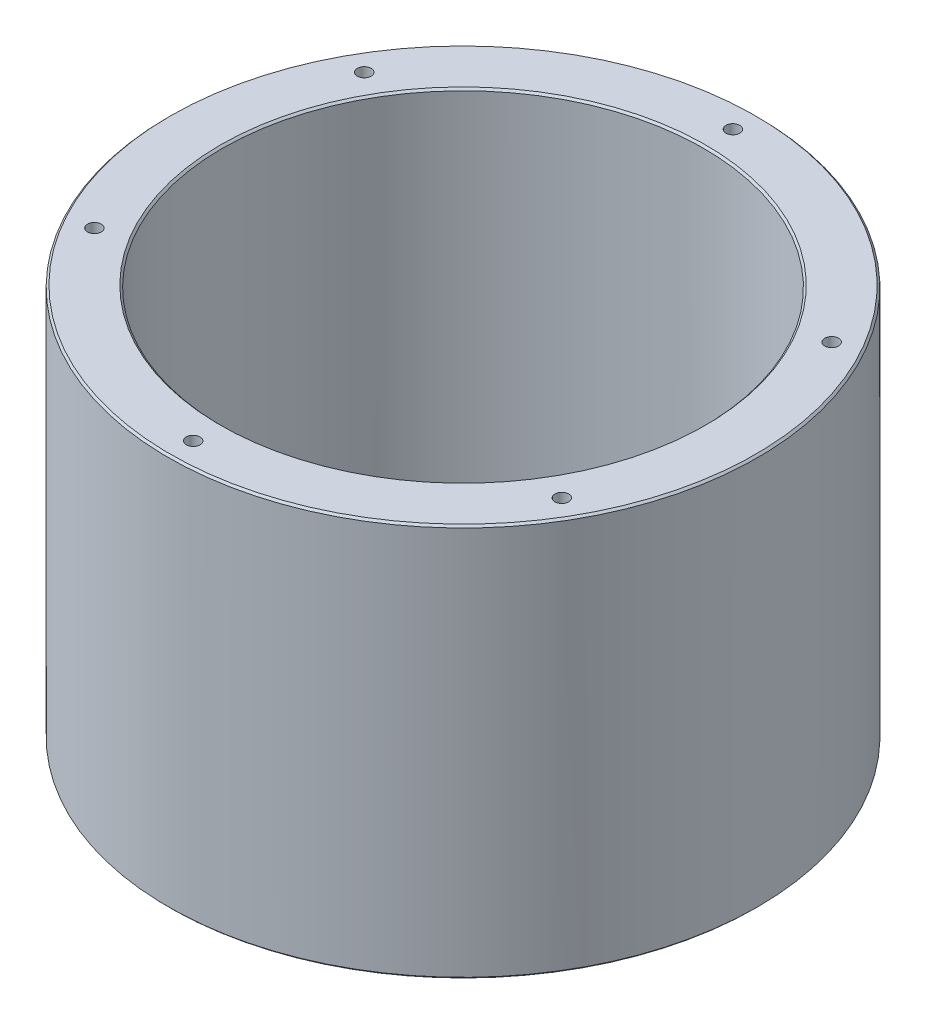
ISO-10303-21;
HEADER;
FILE_DESCRIPTION(('STEP AP214'),'2;1');
FILE_NAME('part.step','',(''),(''),'','','');
FILE_SCHEMA(('AUTOMOTIVE_DESIGN { 1 0 10303 214 1 1 1 1 }'));
ENDSEC;
DATA;
#1=APPLICATION_CONTEXT('core data for automotive mechanical design processes');
#2=APPLICATION_PROTOCOL_DEFINITION('international standard','automotive_design',2000,#1);
#3=PRODUCT_CONTEXT('',#1,'mechanical');
#4=PRODUCT('Part','Part','',(#3));
#5=PRODUCT_RELATED_PRODUCT_CATEGORY('part','',(#4));
#6=PRODUCT_DEFINITION_FORMATION('','',#4);
#7=PRODUCT_DEFINITION_CONTEXT('part definition',#1,'design');
#8=PRODUCT_DEFINITION('design','',#6,#7);
#9=PRODUCT_DEFINITION_SHAPE('','',#8);
#10=(LENGTH_UNIT() NAMED_UNIT(*) SI_UNIT(.MILLI.,.METRE.));
#11=(NAMED_UNIT(*) PLANE_ANGLE_UNIT() SI_UNIT($,.RADIAN.));
#12=(NAMED_UNIT(*) SI_UNIT($,.STERADIAN.) SOLID_ANGLE_UNIT());
#13=UNCERTAINTY_MEASURE_WITH_UNIT(LENGTH_MEASURE(1.E-05),#10,'distance_accuracy_value','');
#14=(GEOMETRIC_REPRESENTATION_CONTEXT(3) GLOBAL_UNCERTAINTY_ASSIGNED_CONTEXT((#13)) GLOBAL_UNIT_ASSIGNED_CONTEXT((#10,
#11,#12)) REPRESENTATION_CONTEXT('',''));
#15=CARTESIAN_POINT('',(0.,0.,0.));
#16=DIRECTION('',(0.,0.,1.));
#17=DIRECTION('',(1.,0.,0.));
#18=AXIS2_PLACEMENT_3D('',#15,#16,#17);
#19=CARTESIAN_POINT('',(0.,193.596256239601,0.));
#20=DIRECTION('',(0.,1.,0.));
#21=DIRECTION('',(-1.,0.,0.));
#22=AXIS2_PLACEMENT_3D('',#19,#20,#21);
#23=CYLINDRICAL_SURFACE('',#22,150.);
#24=CARTESIAN_POINT('',(0.,-25.4037437603992,0.));
#25=DIRECTION('',(0.,-1.,0.));
#26=DIRECTION('',(1.,0.,0.));
#27=AXIS2_PLACEMENT_3D('',#24,#25,#26);
#28=CIRCLE('',#27,150.);
#29=CARTESIAN_POINT('',(150.,-25.4037437603992,0.));
#30=VERTEX_POINT('',#29);
#31=EDGE_CURVE('E168',#30,#30,#28,.F.);
#32=ORIENTED_EDGE('',*,*,#31,.T.);
#33=EDGE_LOOP('',(#32));
#34=FACE_BOUND('',#33,.T.);
#35=CARTESIAN_POINT('',(0.,172.596256239601,0.));
#36=DIRECTION('',(0.,1.,0.));
#37=DIRECTION('',(-1.,0.,0.));
#38=AXIS2_PLACEMENT_3D('',#35,#36,#37);
#39=CIRCLE('',#38,150.);
#40=CARTESIAN_POINT('',(-150.,172.596256239601,0.));
#41=VERTEX_POINT('',#40);
#42=EDGE_CURVE('E165',#41,#41,#39,.F.);
#43=ORIENTED_EDGE('',*,*,#42,.T.);
#44=EDGE_LOOP('',(#43));
#45=FACE_BOUND('',#44,.T.);
#46=ADVANCED_FACE('F39',(#34,#45),#23,.T.);
#47=CARTESIAN_POINT('',(0.,-26.4037437603993,0.));
#48=DIRECTION('',(0.,-1.,0.));
#49=DIRECTION('',(1.,0.,0.));
#50=AXIS2_PLACEMENT_3D('',#47,#48,#49);
#51=PLANE('',#50);
#52=CARTESIAN_POINT('',(0.,-26.4037437603993,-137.316));
#53=DIRECTION('',(0.,-1.,0.));
#54=DIRECTION('',(0.,0.,-1.));
#55=AXIS2_PLACEMENT_3D('',#52,#53,#54);
#56=CIRCLE('',#55,3.49999999999999);
#57=CARTESIAN_POINT('',(0.,-26.4037437603993,-140.816));
#58=VERTEX_POINT('',#57);
#59=EDGE_CURVE('E95',#58,#58,#56,.T.);
#60=ORIENTED_EDGE('',*,*,#59,.F.);
#61=EDGE_LOOP('',(#60));
#62=FACE_BOUND('',#61,.T.);
#63=CARTESIAN_POINT('',(118.919144346064,-26.4037437603993,-68.6580000000001));
#64=DIRECTION('',(0.,-1.,0.));
#65=DIRECTION('',(0.,0.,-1.));
#66=AXIS2_PLACEMENT_3D('',#63,#64,#65);
#67=CIRCLE('',#66,3.49999999999999);
#68=CARTESIAN_POINT('',(118.919144346064,-26.4037437603993,-72.1580000000001));
#69=VERTEX_POINT('',#68);
#70=EDGE_CURVE('E94',#69,#69,#67,.T.);
#71=ORIENTED_EDGE('',*,*,#70,.F.);
#72=EDGE_LOOP('',(#71));
#73=FACE_BOUND('',#72,.T.);
#74=CARTESIAN_POINT('',(118.919144346064,-26.4037437603993,68.6580000000001));
#75=DIRECTION('',(0.,-1.,0.));
#76=DIRECTION('',(0.,0.,-1.));
#77=AXIS2_PLACEMENT_3D('',#74,#75,#76);
#78=CIRCLE('',#77,3.49999999999999);
#79=CARTESIAN_POINT('',(118.919144346064,-26.4037437603993,65.1580000000001));
#80=VERTEX_POINT('',#79);
#81=EDGE_CURVE('E105',#80,#80,#78,.T.);
#82=ORIENTED_EDGE('',*,*,#81,.F.);
#83=EDGE_LOOP('',(#82));
#84=FACE_BOUND('',#83,.T.);
#85=CARTESIAN_POINT('',(0.,-26.4037437603993,137.316));
#86=DIRECTION('',(0.,-1.,0.));
#87=DIRECTION('',(0.,0.,-1.));
#88=AXIS2_PLACEMENT_3D('',#85,#86,#87);
#89=CIRCLE('',#88,3.49999999999999);
#90=CARTESIAN_POINT('',(0.,-26.4037437603993,133.816));
#91=VERTEX_POINT('',#90);
#92=EDGE_CURVE('E111',#91,#91,#89,.T.);
#93=ORIENTED_EDGE('',*,*,#92,.F.);
#94=EDGE_LOOP('',(#93));
#95=FACE_BOUND('',#94,.T.);
#96=CARTESIAN_POINT('',(-118.919144346064,-26.4037437603994,68.6580000000001));
#97=DIRECTION('',(0.,-1.,0.));
#98=DIRECTION('',(0.,0.,-1.));
#99=AXIS2_PLACEMENT_3D('',#96,#97,#98);
#100=CIRCLE('',#99,3.49999999999999);
#101=CARTESIAN_POINT('',(-118.919144346064,-26.4037437603994,65.1580000000001));
#102=VERTEX_POINT('',#101);
#103=EDGE_CURVE('E117',#102,#102,#100,.T.);
#104=ORIENTED_EDGE('',*,*,#103,.F.);
#105=EDGE_LOOP('',(#104));
#106=FACE_BOUND('',#105,.T.);
#107=CARTESIAN_POINT('',(-118.919144346064,-26.4037437603994,-68.658));
#108=DIRECTION('',(0.,-1.,0.));
#109=DIRECTION('',(0.,0.,-1.));
#110=AXIS2_PLACEMENT_3D('',#107,#108,#109);
#111=CIRCLE('',#110,3.49999999999999);
#112=CARTESIAN_POINT('',(-118.919144346064,-26.4037437603994,-72.158));
#113=VERTEX_POINT('',#112);
#114=EDGE_CURVE('E123',#113,#113,#111,.T.);
#115=ORIENTED_EDGE('',*,*,#114,.F.);
#116=EDGE_LOOP('',(#115));
#117=FACE_BOUND('',#116,.T.);
#118=CARTESIAN_POINT('',(0.,-26.4037437603993,0.));
#119=DIRECTION('',(0.,-1.,0.));
#120=DIRECTION('',(1.,0.,0.));
#121=AXIS2_PLACEMENT_3D('',#118,#119,#120);
#122=CIRCLE('',#121,149.);
#123=CARTESIAN_POINT('',(149.,-26.4037437603993,0.));
#124=VERTEX_POINT('',#123);
#125=EDGE_CURVE('E174',#124,#124,#122,.T.);
#126=ORIENTED_EDGE('',*,*,#125,.T.);
#127=EDGE_LOOP('',(#126));
#128=FACE_BOUND('',#127,.T.);
#129=CARTESIAN_POINT('',(0.,-26.4037437603993,0.));
#130=DIRECTION('',(0.,-1.,0.));
#131=DIRECTION('',(1.,0.,0.));
#132=AXIS2_PLACEMENT_3D('',#129,#130,#131);
#133=CIRCLE('',#132,123.5);
#134=CARTESIAN_POINT('',(123.5,-26.4037437603993,0.));
#135=VERTEX_POINT('',#134);
#136=EDGE_CURVE('E171',#135,#135,#133,.F.);
#137=ORIENTED_EDGE('',*,*,#136,.T.);
#138=EDGE_LOOP('',(#137));
#139=FACE_BOUND('',#138,.T.);
#140=ADVANCED_FACE('F201',(#62,#73,#84,#95,#106,#117,#128,#139),#51,.T.);
#141=CARTESIAN_POINT('',(0.,193.596256239601,0.));
#142=DIRECTION('',(0.,1.,0.));
#143=DIRECTION('',(-1.,0.,0.));
#144=AXIS2_PLACEMENT_3D('',#141,#142,#143);
#145=CYLINDRICAL_SURFACE('',#144,122.5);
#146=CARTESIAN_POINT('',(0.,-25.4037437603994,0.));
#147=DIRECTION('',(0.,-1.,0.));
#148=DIRECTION('',(1.,0.,0.));
#149=AXIS2_PLACEMENT_3D('',#146,#147,#148);
#150=CIRCLE('',#149,122.5);
#151=CARTESIAN_POINT('',(122.5,-25.4037437603994,0.));
#152=VERTEX_POINT('',#151);
#153=EDGE_CURVE('E180',#152,#152,#150,.T.);
#154=ORIENTED_EDGE('',*,*,#153,.T.);
#155=EDGE_LOOP('',(#154));
#156=FACE_BOUND('',#155,.T.);
#157=CARTESIAN_POINT('',(0.,172.596256239601,0.));
#158=DIRECTION('',(0.,1.,0.));
#159=DIRECTION('',(-1.,0.,0.));
#160=AXIS2_PLACEMENT_3D('',#157,#158,#159);
#161=CIRCLE('',#160,122.5);
#162=CARTESIAN_POINT('',(-122.5,172.596256239601,0.));
#163=VERTEX_POINT('',#162);
#164=EDGE_CURVE('E177',#163,#163,#161,.T.);
#165=ORIENTED_EDGE('',*,*,#164,.T.);
#166=EDGE_LOOP('',(#165));
#167=FACE_BOUND('',#166,.T.);
#168=ADVANCED_FACE('F207',(#156,#167),#145,.F.);
#169=CARTESIAN_POINT('',(0.,173.596256239601,0.));
#170=DIRECTION('',(0.,1.,0.));
#171=DIRECTION('',(-1.,0.,0.));
#172=AXIS2_PLACEMENT_3D('',#169,#170,#171);
#173=PLANE('',#172);
#174=CARTESIAN_POINT('',(0.,173.596256239601,-137.316));
#175=DIRECTION('',(0.,1.,0.));
#176=DIRECTION('',(0.,0.,1.));
#177=AXIS2_PLACEMENT_3D('',#174,#175,#176);
#178=CIRCLE('',#177,3.49999999999999);
#179=CARTESIAN_POINT('',(0.,173.596256239601,-133.816));
#180=VERTEX_POINT('',#179);
#181=EDGE_CURVE('E129',#180,#180,#178,.T.);
#182=ORIENTED_EDGE('',*,*,#181,.F.);
#183=EDGE_LOOP('',(#182));
#184=FACE_BOUND('',#183,.T.);
#185=CARTESIAN_POINT('',(118.919144346064,173.596256239601,-68.658));
#186=DIRECTION('',(0.,1.,0.));
#187=DIRECTION('',(0.,0.,1.));
#188=AXIS2_PLACEMENT_3D('',#185,#186,#187);
#189=CIRCLE('',#188,3.49999999999999);
#190=CARTESIAN_POINT('',(118.919144346064,173.596256239601,-65.158));
#191=VERTEX_POINT('',#190);
#192=EDGE_CURVE('E135',#191,#191,#189,.T.);
#193=ORIENTED_EDGE('',*,*,#192,.F.);
#194=EDGE_LOOP('',(#193));
#195=FACE_BOUND('',#194,.T.);
#196=CARTESIAN_POINT('',(118.919144346064,173.596256239601,68.6580000000001));
#197=DIRECTION('',(0.,1.,0.));
#198=DIRECTION('',(0.,0.,1.));
#199=AXIS2_PLACEMENT_3D('',#196,#197,#198);
#200=CIRCLE('',#199,3.49999999999999);
#201=CARTESIAN_POINT('',(118.919144346064,173.596256239601,72.158));
#202=VERTEX_POINT('',#201);
#203=EDGE_CURVE('E141',#202,#202,#200,.T.);
#204=ORIENTED_EDGE('',*,*,#203,.F.);
#205=EDGE_LOOP('',(#204));
#206=FACE_BOUND('',#205,.T.);
#207=CARTESIAN_POINT('',(0.,173.596256239601,137.316));
#208=DIRECTION('',(0.,1.,0.));
#209=DIRECTION('',(0.,0.,1.));
#210=AXIS2_PLACEMENT_3D('',#207,#208,#209);
#211=CIRCLE('',#210,3.49999999999999);
#212=CARTESIAN_POINT('',(0.,173.596256239601,140.816));
#213=VERTEX_POINT('',#212);
#214=EDGE_CURVE('E147',#213,#213,#211,.T.);
#215=ORIENTED_EDGE('',*,*,#214,.F.);
#216=EDGE_LOOP('',(#215));
#217=FACE_BOUND('',#216,.T.);
#218=CARTESIAN_POINT('',(-118.919144346064,173.596256239601,68.6580000000001));
#219=DIRECTION('',(0.,1.,0.));
#220=DIRECTION('',(0.,0.,1.));
#221=AXIS2_PLACEMENT_3D('',#218,#219,#220);
#222=CIRCLE('',#221,3.49999999999999);
#223=CARTESIAN_POINT('',(-118.919144346064,173.596256239601,72.1580000000001));
#224=VERTEX_POINT('',#223);
#225=EDGE_CURVE('E153',#224,#224,#222,.T.);
#226=ORIENTED_EDGE('',*,*,#225,.F.);
#227=EDGE_LOOP('',(#226));
#228=FACE_BOUND('',#227,.T.);
#229=CARTESIAN_POINT('',(-118.919144346064,173.596256239601,-68.658));
#230=DIRECTION('',(0.,1.,0.));
#231=DIRECTION('',(0.,0.,1.));
#232=AXIS2_PLACEMENT_3D('',#229,#230,#231);
#233=CIRCLE('',#232,3.49999999999999);
#234=CARTESIAN_POINT('',(-118.919144346064,173.596256239601,-65.158));
#235=VERTEX_POINT('',#234);
#236=EDGE_CURVE('E159',#235,#235,#233,.T.);
#237=ORIENTED_EDGE('',*,*,#236,.F.);
#238=EDGE_LOOP('',(#237));
#239=FACE_BOUND('',#238,.T.);
#240=CARTESIAN_POINT('',(0.,173.596256239601,0.));
#241=DIRECTION('',(0.,1.,0.));
#242=DIRECTION('',(-1.,0.,0.));
#243=AXIS2_PLACEMENT_3D('',#240,#241,#242);
#244=CIRCLE('',#243,123.5);
#245=CARTESIAN_POINT('',(-123.5,173.596256239601,0.));
#246=VERTEX_POINT('',#245);
#247=EDGE_CURVE('E11',#246,#246,#244,.F.);
#248=ORIENTED_EDGE('',*,*,#247,.T.);
#249=EDGE_LOOP('',(#248));
#250=FACE_BOUND('',#249,.T.);
#251=CARTESIAN_POINT('',(0.,173.596256239601,0.));
#252=DIRECTION('',(0.,1.,0.));
#253=DIRECTION('',(-1.,0.,0.));
#254=AXIS2_PLACEMENT_3D('',#251,#252,#253);
#255=CIRCLE('',#254,149.);
#256=CARTESIAN_POINT('',(-149.,173.596256239601,0.));
#257=VERTEX_POINT('',#256);
#258=EDGE_CURVE('E47',#257,#257,#255,.T.);
#259=ORIENTED_EDGE('',*,*,#258,.T.);
#260=EDGE_LOOP('',(#259));
#261=FACE_BOUND('',#260,.T.);
#262=ADVANCED_FACE('F185',(#184,#195,#206,#217,#228,#239,#250,#261),#173,.T.);
#263=CARTESIAN_POINT('',(0.,-25.4037437603992,0.));
#264=DIRECTION('',(0.,1.,0.));
#265=DIRECTION('',(-1.,0.,0.));
#266=AXIS2_PLACEMENT_3D('',#263,#264,#265);
#267=CONICAL_SURFACE('',#266,150.,0.785398163397476);
#268=ORIENTED_EDGE('',*,*,#125,.F.);
#269=EDGE_LOOP('',(#268));
#270=FACE_BOUND('',#269,.T.);
#271=ORIENTED_EDGE('',*,*,#31,.F.);
#272=EDGE_LOOP('',(#271));
#273=FACE_BOUND('',#272,.T.);
#274=ADVANCED_FACE('F213',(#270,#273),#267,.T.);
#275=CARTESIAN_POINT('',(0.,-26.4037437603993,0.));
#276=DIRECTION('',(0.,-1.,0.));
#277=DIRECTION('',(1.,0.,0.));
#278=AXIS2_PLACEMENT_3D('',#275,#276,#277);
#279=CONICAL_SURFACE('',#278,123.5,0.785398163397455);
#280=ORIENTED_EDGE('',*,*,#153,.F.);
#281=EDGE_LOOP('',(#280));
#282=FACE_BOUND('',#281,.T.);
#283=ORIENTED_EDGE('',*,*,#136,.F.);
#284=EDGE_LOOP('',(#283));
#285=FACE_BOUND('',#284,.T.);
#286=ADVANCED_FACE('F197',(#282,#285),#279,.F.);
#287=CARTESIAN_POINT('',(0.,172.596256239601,0.));
#288=DIRECTION('',(0.,1.,0.));
#289=DIRECTION('',(-1.,0.,0.));
#290=AXIS2_PLACEMENT_3D('',#287,#288,#289);
#291=CONICAL_SURFACE('',#290,122.5,0.785398163397469);
#292=ORIENTED_EDGE('',*,*,#247,.F.);
#293=EDGE_LOOP('',(#292));
#294=FACE_BOUND('',#293,.T.);
#295=ORIENTED_EDGE('',*,*,#164,.F.);
#296=EDGE_LOOP('',(#295));
#297=FACE_BOUND('',#296,.T.);
#298=ADVANCED_FACE('F189',(#294,#297),#291,.F.);
#299=CARTESIAN_POINT('',(0.,173.596256239601,0.));
#300=DIRECTION('',(0.,-1.,0.));
#301=DIRECTION('',(1.,0.,0.));
#302=AXIS2_PLACEMENT_3D('',#299,#300,#301);
#303=CONICAL_SURFACE('',#302,149.,0.785398163397462);
#304=ORIENTED_EDGE('',*,*,#42,.F.);
#305=EDGE_LOOP('',(#304));
#306=FACE_BOUND('',#305,.T.);
#307=ORIENTED_EDGE('',*,*,#258,.F.);
#308=EDGE_LOOP('',(#307));
#309=FACE_BOUND('',#308,.T.);
#310=ADVANCED_FACE('F41',(#306,#309),#303,.T.);
#311=CARTESIAN_POINT('',(-118.919144346064,98.5962562396007,-68.658));
#312=DIRECTION('',(0.,1.,0.));
#313=DIRECTION('',(0.,0.,1.));
#314=AXIS2_PLACEMENT_3D('',#311,#312,#313);
#315=CONICAL_SURFACE('',#314,3.49999999999998,1.02974425867665);
#316=CARTESIAN_POINT('',(-118.919144346064,96.4932440730042,-68.658));
#317=VERTEX_POINT('',#316);
#318=VERTEX_LOOP('',#317);
#319=FACE_BOUND('',#318,.T.);
#320=CARTESIAN_POINT('',(-118.919144346064,98.5962562396007,-68.658));
#321=DIRECTION('',(0.,1.,0.));
#322=DIRECTION('',(0.,0.,1.));
#323=AXIS2_PLACEMENT_3D('',#320,#321,#322);
#324=CIRCLE('',#323,3.49999999999998);
#325=CARTESIAN_POINT('',(-118.919144346064,98.5962562396007,-65.158));
#326=VERTEX_POINT('',#325);
#327=EDGE_CURVE('E162',#326,#326,#324,.T.);
#328=ORIENTED_EDGE('',*,*,#327,.T.);
#329=EDGE_LOOP('',(#328));
#330=FACE_BOUND('',#329,.T.);
#331=ADVANCED_FACE('F188',(#319,#330),#315,.F.);
#332=CARTESIAN_POINT('',(-118.919144346064,173.596256239601,-68.658));
#333=DIRECTION('',(0.,1.,0.));
#334=DIRECTION('',(0.,0.,1.));
#335=AXIS2_PLACEMENT_3D('',#332,#333,#334);
#336=CYLINDRICAL_SURFACE('',#335,3.49999999999998);
#337=ORIENTED_EDGE('',*,*,#327,.F.);
#338=EDGE_LOOP('',(#337));
#339=FACE_BOUND('',#338,.T.);
#340=ORIENTED_EDGE('',*,*,#236,.T.);
#341=EDGE_LOOP('',(#340));
#342=FACE_BOUND('',#341,.T.);
#343=ADVANCED_FACE('F195',(#339,#342),#336,.F.);
#344=CARTESIAN_POINT('',(-118.919144346064,98.5962562396007,68.6580000000001));
#345=DIRECTION('',(0.,1.,0.));
#346=DIRECTION('',(0.,0.,1.));
#347=AXIS2_PLACEMENT_3D('',#344,#345,#346);
#348=CONICAL_SURFACE('',#347,3.49999999999998,1.02974425867665);
#349=CARTESIAN_POINT('',(-118.919144346064,96.4932440730042,68.658));
#350=VERTEX_POINT('',#349);
#351=VERTEX_LOOP('',#350);
#352=FACE_BOUND('',#351,.T.);
#353=CARTESIAN_POINT('',(-118.919144346064,98.5962562396007,68.6580000000001));
#354=DIRECTION('',(0.,1.,0.));
#355=DIRECTION('',(0.,0.,1.));
#356=AXIS2_PLACEMENT_3D('',#353,#354,#355);
#357=CIRCLE('',#356,3.49999999999998);
#358=CARTESIAN_POINT('',(-118.919144346064,98.5962562396007,72.158));
#359=VERTEX_POINT('',#358);
#360=EDGE_CURVE('E156',#359,#359,#357,.T.);
#361=ORIENTED_EDGE('',*,*,#360,.T.);
#362=EDGE_LOOP('',(#361));
#363=FACE_BOUND('',#362,.T.);
#364=ADVANCED_FACE('F238',(#352,#363),#348,.F.);
#365=CARTESIAN_POINT('',(-118.919144346064,173.596256239601,68.6580000000001));
#366=DIRECTION('',(0.,1.,0.));
#367=DIRECTION('',(0.,0.,1.));
#368=AXIS2_PLACEMENT_3D('',#365,#366,#367);
#369=CYLINDRICAL_SURFACE('',#368,3.49999999999998);
#370=ORIENTED_EDGE('',*,*,#360,.F.);
#371=EDGE_LOOP('',(#370));
#372=FACE_BOUND('',#371,.T.);
#373=ORIENTED_EDGE('',*,*,#225,.T.);
#374=EDGE_LOOP('',(#373));
#375=FACE_BOUND('',#374,.T.);
#376=ADVANCED_FACE('F242',(#372,#375),#369,.F.);
#377=CARTESIAN_POINT('',(0.,98.5962562396007,137.316));
#378=DIRECTION('',(0.,1.,0.));
#379=DIRECTION('',(0.,0.,1.));
#380=AXIS2_PLACEMENT_3D('',#377,#378,#379);
#381=CONICAL_SURFACE('',#380,3.49999999999998,1.02974425867665);
#382=CARTESIAN_POINT('',(0.,96.4932440730042,137.316));
#383=VERTEX_POINT('',#382);
#384=VERTEX_LOOP('',#383);
#385=FACE_BOUND('',#384,.T.);
#386=CARTESIAN_POINT('',(0.,98.5962562396007,137.316));
#387=DIRECTION('',(0.,1.,0.));
#388=DIRECTION('',(0.,0.,1.));
#389=AXIS2_PLACEMENT_3D('',#386,#387,#388);
#390=CIRCLE('',#389,3.49999999999998);
#391=CARTESIAN_POINT('',(0.,98.5962562396007,140.816));
#392=VERTEX_POINT('',#391);
#393=EDGE_CURVE('E150',#392,#392,#390,.T.);
#394=ORIENTED_EDGE('',*,*,#393,.T.);
#395=EDGE_LOOP('',(#394));
#396=FACE_BOUND('',#395,.T.);
#397=ADVANCED_FACE('F245',(#385,#396),#381,.F.);
#398=CARTESIAN_POINT('',(0.,173.596256239601,137.316));
#399=DIRECTION('',(0.,1.,0.));
#400=DIRECTION('',(0.,0.,1.));
#401=AXIS2_PLACEMENT_3D('',#398,#399,#400);
#402=CYLINDRICAL_SURFACE('',#401,3.49999999999998);
#403=ORIENTED_EDGE('',*,*,#393,.F.);
#404=EDGE_LOOP('',(#403));
#405=FACE_BOUND('',#404,.T.);
#406=ORIENTED_EDGE('',*,*,#214,.T.);
#407=EDGE_LOOP('',(#406));
#408=FACE_BOUND('',#407,.T.);
#409=ADVANCED_FACE('F249',(#405,#408),#402,.F.);
#410=CARTESIAN_POINT('',(118.919144346064,98.5962562396007,68.6580000000001));
#411=DIRECTION('',(0.,1.,0.));
#412=DIRECTION('',(0.,0.,1.));
#413=AXIS2_PLACEMENT_3D('',#410,#411,#412);
#414=CONICAL_SURFACE('',#413,3.49999999999998,1.02974425867665);
#415=CARTESIAN_POINT('',(118.919144346064,96.4932440730042,68.6580000000001));
#416=VERTEX_POINT('',#415);
#417=VERTEX_LOOP('',#416);
#418=FACE_BOUND('',#417,.T.);
#419=CARTESIAN_POINT('',(118.919144346064,98.5962562396007,68.6580000000001));
#420=DIRECTION('',(0.,1.,0.));
#421=DIRECTION('',(0.,0.,1.));
#422=AXIS2_PLACEMENT_3D('',#419,#420,#421);
#423=CIRCLE('',#422,3.49999999999998);
#424=CARTESIAN_POINT('',(118.919144346064,98.5962562396007,72.158));
#425=VERTEX_POINT('',#424);
#426=EDGE_CURVE('E144',#425,#425,#423,.T.);
#427=ORIENTED_EDGE('',*,*,#426,.T.);
#428=EDGE_LOOP('',(#427));
#429=FACE_BOUND('',#428,.T.);
#430=ADVANCED_FACE('F253',(#418,#429),#414,.F.);
#431=CARTESIAN_POINT('',(118.919144346064,173.596256239601,68.6580000000001));
#432=DIRECTION('',(0.,1.,0.));
#433=DIRECTION('',(0.,0.,1.));
#434=AXIS2_PLACEMENT_3D('',#431,#432,#433);
#435=CYLINDRICAL_SURFACE('',#434,3.49999999999998);
#436=ORIENTED_EDGE('',*,*,#426,.F.);
#437=EDGE_LOOP('',(#436));
#438=FACE_BOUND('',#437,.T.);
#439=ORIENTED_EDGE('',*,*,#203,.T.);
#440=EDGE_LOOP('',(#439));
#441=FACE_BOUND('',#440,.T.);
#442=ADVANCED_FACE('F257',(#438,#441),#435,.F.);
#443=CARTESIAN_POINT('',(118.919144346064,98.5962562396007,-68.658));
#444=DIRECTION('',(0.,1.,0.));
#445=DIRECTION('',(0.,0.,1.));
#446=AXIS2_PLACEMENT_3D('',#443,#444,#445);
#447=CONICAL_SURFACE('',#446,3.49999999999998,1.02974425867665);
#448=CARTESIAN_POINT('',(118.919144346064,96.4932440730042,-68.6580000000001));
#449=VERTEX_POINT('',#448);
#450=VERTEX_LOOP('',#449);
#451=FACE_BOUND('',#450,.T.);
#452=CARTESIAN_POINT('',(118.919144346064,98.5962562396007,-68.658));
#453=DIRECTION('',(0.,1.,0.));
#454=DIRECTION('',(0.,0.,1.));
#455=AXIS2_PLACEMENT_3D('',#452,#453,#454);
#456=CIRCLE('',#455,3.49999999999998);
#457=CARTESIAN_POINT('',(118.919144346064,98.5962562396007,-65.1580000000001));
#458=VERTEX_POINT('',#457);
#459=EDGE_CURVE('E138',#458,#458,#456,.T.);
#460=ORIENTED_EDGE('',*,*,#459,.T.);
#461=EDGE_LOOP('',(#460));
#462=FACE_BOUND('',#461,.T.);
#463=ADVANCED_FACE('F261',(#451,#462),#447,.F.);
#464=CARTESIAN_POINT('',(118.919144346064,173.596256239601,-68.658));
#465=DIRECTION('',(0.,1.,0.));
#466=DIRECTION('',(0.,0.,1.));
#467=AXIS2_PLACEMENT_3D('',#464,#465,#466);
#468=CYLINDRICAL_SURFACE('',#467,3.49999999999998);
#469=ORIENTED_EDGE('',*,*,#459,.F.);
#470=EDGE_LOOP('',(#469));
#471=FACE_BOUND('',#470,.T.);
#472=ORIENTED_EDGE('',*,*,#192,.T.);
#473=EDGE_LOOP('',(#472));
#474=FACE_BOUND('',#473,.T.);
#475=ADVANCED_FACE('F265',(#471,#474),#468,.F.);
#476=CARTESIAN_POINT('',(0.,98.5962562396007,-137.316));
#477=DIRECTION('',(0.,1.,0.));
#478=DIRECTION('',(0.,0.,1.));
#479=AXIS2_PLACEMENT_3D('',#476,#477,#478);
#480=CONICAL_SURFACE('',#479,3.49999999999998,1.02974425867665);
#481=CARTESIAN_POINT('',(0.,96.4932440730042,-137.316));
#482=VERTEX_POINT('',#481);
#483=VERTEX_LOOP('',#482);
#484=FACE_BOUND('',#483,.T.);
#485=CARTESIAN_POINT('',(0.,98.5962562396007,-137.316));
#486=DIRECTION('',(0.,1.,0.));
#487=DIRECTION('',(0.,0.,1.));
#488=AXIS2_PLACEMENT_3D('',#485,#486,#487);
#489=CIRCLE('',#488,3.49999999999998);
#490=CARTESIAN_POINT('',(0.,98.5962562396007,-133.816));
#491=VERTEX_POINT('',#490);
#492=EDGE_CURVE('E132',#491,#491,#489,.T.);
#493=ORIENTED_EDGE('',*,*,#492,.T.);
#494=EDGE_LOOP('',(#493));
#495=FACE_BOUND('',#494,.T.);
#496=ADVANCED_FACE('F269',(#484,#495),#480,.F.);
#497=CARTESIAN_POINT('',(0.,173.596256239601,-137.316));
#498=DIRECTION('',(0.,1.,0.));
#499=DIRECTION('',(0.,0.,1.));
#500=AXIS2_PLACEMENT_3D('',#497,#498,#499);
#501=CYLINDRICAL_SURFACE('',#500,3.49999999999998);
#502=ORIENTED_EDGE('',*,*,#492,.F.);
#503=EDGE_LOOP('',(#502));
#504=FACE_BOUND('',#503,.T.);
#505=ORIENTED_EDGE('',*,*,#181,.T.);
#506=EDGE_LOOP('',(#505));
#507=FACE_BOUND('',#506,.T.);
#508=ADVANCED_FACE('F273',(#504,#507),#501,.F.);
#509=CARTESIAN_POINT('',(-118.919144346064,48.5962562396006,-68.658));
#510=DIRECTION('',(0.,-1.,0.));
#511=DIRECTION('',(0.,0.,-1.));
#512=AXIS2_PLACEMENT_3D('',#509,#510,#511);
#513=CONICAL_SURFACE('',#512,3.49999999999998,1.02974425867665);
#514=CARTESIAN_POINT('',(-118.919144346064,50.6992684061971,-68.658));
#515=VERTEX_POINT('',#514);
#516=VERTEX_LOOP('',#515);
#517=FACE_BOUND('',#516,.T.);
#518=CARTESIAN_POINT('',(-118.919144346064,48.5962562396006,-68.658));
#519=DIRECTION('',(0.,-1.,0.));
#520=DIRECTION('',(0.,0.,-1.));
#521=AXIS2_PLACEMENT_3D('',#518,#519,#520);
#522=CIRCLE('',#521,3.49999999999998);
#523=CARTESIAN_POINT('',(-118.919144346064,48.5962562396006,-72.158));
#524=VERTEX_POINT('',#523);
#525=EDGE_CURVE('E126',#524,#524,#522,.T.);
#526=ORIENTED_EDGE('',*,*,#525,.T.);
#527=EDGE_LOOP('',(#526));
#528=FACE_BOUND('',#527,.T.);
#529=ADVANCED_FACE('F277',(#517,#528),#513,.F.);
#530=CARTESIAN_POINT('',(-118.919144346064,-26.4037437603994,-68.658));
#531=DIRECTION('',(0.,-1.,0.));
#532=DIRECTION('',(0.,0.,-1.));
#533=AXIS2_PLACEMENT_3D('',#530,#531,#532);
#534=CYLINDRICAL_SURFACE('',#533,3.49999999999998);
#535=ORIENTED_EDGE('',*,*,#525,.F.);
#536=EDGE_LOOP('',(#535));
#537=FACE_BOUND('',#536,.T.);
#538=ORIENTED_EDGE('',*,*,#114,.T.);
#539=EDGE_LOOP('',(#538));
#540=FACE_BOUND('',#539,.T.);
#541=ADVANCED_FACE('F281',(#537,#540),#534,.F.);
#542=CARTESIAN_POINT('',(-118.919144346064,48.5962562396006,68.6580000000001));
#543=DIRECTION('',(0.,-1.,0.));
#544=DIRECTION('',(0.,0.,-1.));
#545=AXIS2_PLACEMENT_3D('',#542,#543,#544);
#546=CONICAL_SURFACE('',#545,3.49999999999998,1.02974425867665);
#547=CARTESIAN_POINT('',(-118.919144346064,50.6992684061971,68.6580000000001));
#548=VERTEX_POINT('',#547);
#549=VERTEX_LOOP('',#548);
#550=FACE_BOUND('',#549,.T.);
#551=CARTESIAN_POINT('',(-118.919144346064,48.5962562396006,68.6580000000001));
#552=DIRECTION('',(0.,-1.,0.));
#553=DIRECTION('',(0.,0.,-1.));
#554=AXIS2_PLACEMENT_3D('',#551,#552,#553);
#555=CIRCLE('',#554,3.49999999999998);
#556=CARTESIAN_POINT('',(-118.919144346064,48.5962562396006,65.1580000000001));
#557=VERTEX_POINT('',#556);
#558=EDGE_CURVE('E120',#557,#557,#555,.T.);
#559=ORIENTED_EDGE('',*,*,#558,.T.);
#560=EDGE_LOOP('',(#559));
#561=FACE_BOUND('',#560,.T.);
#562=ADVANCED_FACE('F285',(#550,#561),#546,.F.);
#563=CARTESIAN_POINT('',(-118.919144346064,-26.4037437603994,68.6580000000001));
#564=DIRECTION('',(0.,-1.,0.));
#565=DIRECTION('',(0.,0.,-1.));
#566=AXIS2_PLACEMENT_3D('',#563,#564,#565);
#567=CYLINDRICAL_SURFACE('',#566,3.49999999999998);
#568=ORIENTED_EDGE('',*,*,#558,.F.);
#569=EDGE_LOOP('',(#568));
#570=FACE_BOUND('',#569,.T.);
#571=ORIENTED_EDGE('',*,*,#103,.T.);
#572=EDGE_LOOP('',(#571));
#573=FACE_BOUND('',#572,.T.);
#574=ADVANCED_FACE('F289',(#570,#573),#567,.F.);
#575=CARTESIAN_POINT('',(0.,48.5962562396007,137.316));
#576=DIRECTION('',(0.,-1.,0.));
#577=DIRECTION('',(0.,0.,-1.));
#578=AXIS2_PLACEMENT_3D('',#575,#576,#577);
#579=CONICAL_SURFACE('',#578,3.49999999999998,1.02974425867665);
#580=CARTESIAN_POINT('',(0.,50.6992684061971,137.316));
#581=VERTEX_POINT('',#580);
#582=VERTEX_LOOP('',#581);
#583=FACE_BOUND('',#582,.T.);
#584=CARTESIAN_POINT('',(0.,48.5962562396007,137.316));
#585=DIRECTION('',(0.,-1.,0.));
#586=DIRECTION('',(0.,0.,-1.));
#587=AXIS2_PLACEMENT_3D('',#584,#585,#586);
#588=CIRCLE('',#587,3.49999999999998);
#589=CARTESIAN_POINT('',(0.,48.5962562396007,133.816));
#590=VERTEX_POINT('',#589);
#591=EDGE_CURVE('E114',#590,#590,#588,.T.);
#592=ORIENTED_EDGE('',*,*,#591,.T.);
#593=EDGE_LOOP('',(#592));
#594=FACE_BOUND('',#593,.T.);
#595=ADVANCED_FACE('F293',(#583,#594),#579,.F.);
#596=CARTESIAN_POINT('',(0.,-26.4037437603993,137.316));
#597=DIRECTION('',(0.,-1.,0.));
#598=DIRECTION('',(0.,0.,-1.));
#599=AXIS2_PLACEMENT_3D('',#596,#597,#598);
#600=CYLINDRICAL_SURFACE('',#599,3.49999999999998);
#601=ORIENTED_EDGE('',*,*,#591,.F.);
#602=EDGE_LOOP('',(#601));
#603=FACE_BOUND('',#602,.T.);
#604=ORIENTED_EDGE('',*,*,#92,.T.);
#605=EDGE_LOOP('',(#604));
#606=FACE_BOUND('',#605,.T.);
#607=ADVANCED_FACE('F297',(#603,#606),#600,.F.);
#608=CARTESIAN_POINT('',(118.919144346064,48.5962562396007,68.6580000000001));
#609=DIRECTION('',(0.,-1.,0.));
#610=DIRECTION('',(0.,0.,-1.));
#611=AXIS2_PLACEMENT_3D('',#608,#609,#610);
#612=CONICAL_SURFACE('',#611,3.49999999999998,1.02974425867665);
#613=CARTESIAN_POINT('',(118.919144346064,50.6992684061971,68.6580000000001));
#614=VERTEX_POINT('',#613);
#615=VERTEX_LOOP('',#614);
#616=FACE_BOUND('',#615,.T.);
#617=CARTESIAN_POINT('',(118.919144346064,48.5962562396007,68.6580000000001));
#618=DIRECTION('',(0.,-1.,0.));
#619=DIRECTION('',(0.,0.,-1.));
#620=AXIS2_PLACEMENT_3D('',#617,#618,#619);
#621=CIRCLE('',#620,3.49999999999998);
#622=CARTESIAN_POINT('',(118.919144346064,48.5962562396007,65.1580000000001));
#623=VERTEX_POINT('',#622);
#624=EDGE_CURVE('E108',#623,#623,#621,.T.);
#625=ORIENTED_EDGE('',*,*,#624,.T.);
#626=EDGE_LOOP('',(#625));
#627=FACE_BOUND('',#626,.T.);
#628=ADVANCED_FACE('F301',(#616,#627),#612,.F.);
#629=CARTESIAN_POINT('',(118.919144346064,-26.4037437603993,68.6580000000001));
#630=DIRECTION('',(0.,-1.,0.));
#631=DIRECTION('',(0.,0.,-1.));
#632=AXIS2_PLACEMENT_3D('',#629,#630,#631);
#633=CYLINDRICAL_SURFACE('',#632,3.49999999999998);
#634=ORIENTED_EDGE('',*,*,#624,.F.);
#635=EDGE_LOOP('',(#634));
#636=FACE_BOUND('',#635,.T.);
#637=ORIENTED_EDGE('',*,*,#81,.T.);
#638=EDGE_LOOP('',(#637));
#639=FACE_BOUND('',#638,.T.);
#640=ADVANCED_FACE('F305',(#636,#639),#633,.F.);
#641=CARTESIAN_POINT('',(118.919144346064,48.5962562396007,-68.6580000000001));
#642=DIRECTION('',(0.,-1.,0.));
#643=DIRECTION('',(0.,0.,-1.));
#644=AXIS2_PLACEMENT_3D('',#641,#642,#643);
#645=CONICAL_SURFACE('',#644,3.49999999999998,1.02974425867665);
#646=CARTESIAN_POINT('',(118.919144346064,50.6992684061971,-68.658));
#647=VERTEX_POINT('',#646);
#648=VERTEX_LOOP('',#647);
#649=FACE_BOUND('',#648,.T.);
#650=CARTESIAN_POINT('',(118.919144346064,48.5962562396007,-68.6580000000001));
#651=DIRECTION('',(0.,-1.,0.));
#652=DIRECTION('',(0.,0.,-1.));
#653=AXIS2_PLACEMENT_3D('',#650,#651,#652);
#654=CIRCLE('',#653,3.49999999999998);
#655=CARTESIAN_POINT('',(118.919144346064,48.5962562396007,-72.158));
#656=VERTEX_POINT('',#655);
#657=EDGE_CURVE('E98',#656,#656,#654,.T.);
#658=ORIENTED_EDGE('',*,*,#657,.T.);
#659=EDGE_LOOP('',(#658));
#660=FACE_BOUND('',#659,.T.);
#661=ADVANCED_FACE('F309',(#649,#660),#645,.F.);
#662=CARTESIAN_POINT('',(118.919144346064,-26.4037437603993,-68.6580000000001));
#663=DIRECTION('',(0.,-1.,0.));
#664=DIRECTION('',(0.,0.,-1.));
#665=AXIS2_PLACEMENT_3D('',#662,#663,#664);
#666=CYLINDRICAL_SURFACE('',#665,3.49999999999998);
#667=ORIENTED_EDGE('',*,*,#657,.F.);
#668=EDGE_LOOP('',(#667));
#669=FACE_BOUND('',#668,.T.);
#670=ORIENTED_EDGE('',*,*,#70,.T.);
#671=EDGE_LOOP('',(#670));
#672=FACE_BOUND('',#671,.T.);
#673=ADVANCED_FACE('F88',(#669,#672),#666,.F.);
#674=CARTESIAN_POINT('',(0.,48.5962562396007,-137.316));
#675=DIRECTION('',(0.,-1.,0.));
#676=DIRECTION('',(0.,0.,-1.));
#677=AXIS2_PLACEMENT_3D('',#674,#675,#676);
#678=CONICAL_SURFACE('',#677,3.49999999999998,1.02974425867665);
#679=CARTESIAN_POINT('',(0.,50.6992684061971,-137.316));
#680=VERTEX_POINT('',#679);
#681=VERTEX_LOOP('',#680);
#682=FACE_BOUND('',#681,.T.);
#683=CARTESIAN_POINT('',(0.,48.5962562396007,-137.316));
#684=DIRECTION('',(0.,-1.,0.));
#685=DIRECTION('',(0.,0.,-1.));
#686=AXIS2_PLACEMENT_3D('',#683,#684,#685);
#687=CIRCLE('',#686,3.49999999999998);
#688=CARTESIAN_POINT('',(0.,48.5962562396007,-140.816));
#689=VERTEX_POINT('',#688);
#690=EDGE_CURVE('E92',#689,#689,#687,.T.);
#691=ORIENTED_EDGE('',*,*,#690,.T.);
#692=EDGE_LOOP('',(#691));
#693=FACE_BOUND('',#692,.T.);
#694=ADVANCED_FACE('F84',(#682,#693),#678,.F.);
#695=CARTESIAN_POINT('',(0.,-26.4037437603993,-137.316));
#696=DIRECTION('',(0.,-1.,0.));
#697=DIRECTION('',(0.,0.,-1.));
#698=AXIS2_PLACEMENT_3D('',#695,#696,#697);
#699=CYLINDRICAL_SURFACE('',#698,3.49999999999998);
#700=ORIENTED_EDGE('',*,*,#690,.F.);
#701=EDGE_LOOP('',(#700));
#702=FACE_BOUND('',#701,.T.);
#703=ORIENTED_EDGE('',*,*,#59,.T.);
#704=EDGE_LOOP('',(#703));
#705=FACE_BOUND('',#704,.T.);
#706=ADVANCED_FACE('F87',(#702,#705),#699,.F.);
#707=CLOSED_SHELL('',(#46,#140,#168,#262,#274,#286,#298,#310,#331,#343,#364,#376,#397,#409,#430,
#442,#463,#475,#496,#508,#529,#541,#562,#574,#595,#607,#628,#640,#661,#673,#694,#706));
#708=MANIFOLD_SOLID_BREP('B2',#707);
#709=ADVANCED_BREP_SHAPE_REPRESENTATION('',(#18,#708),#14);
#710=SHAPE_DEFINITION_REPRESENTATION(#9,#709);
ENDSEC;
END-ISO-10303-21;
